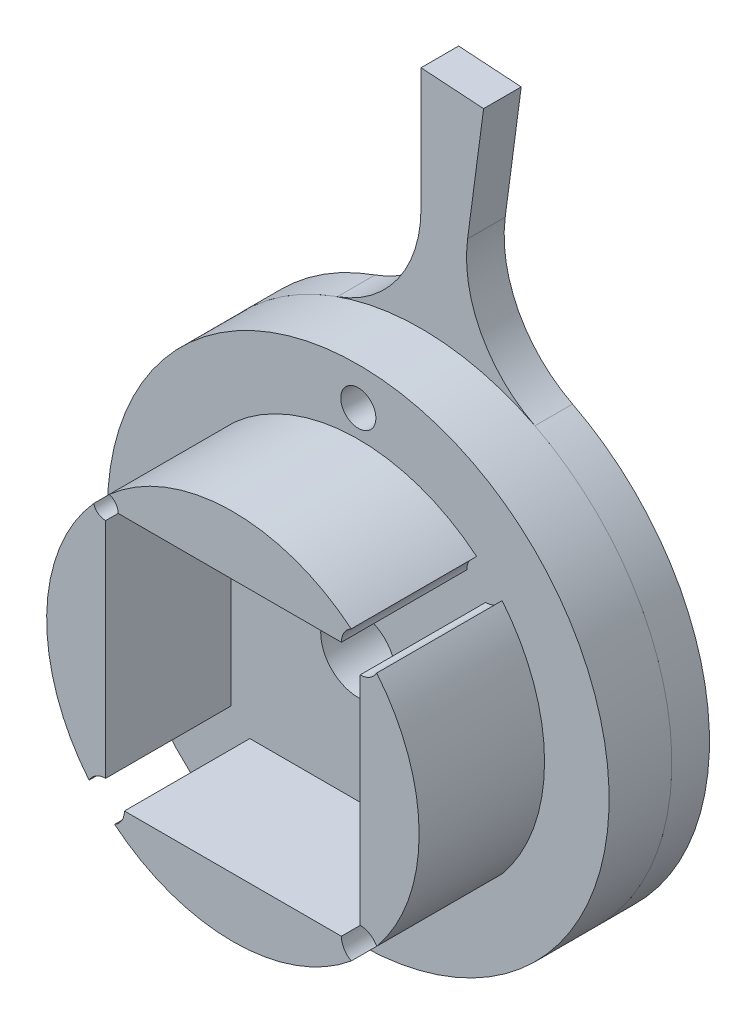
ISO-10303-21;
HEADER;
FILE_DESCRIPTION(('STEP AP214'),'2;1');
FILE_NAME('part.step','',(''),(''),'','','');
FILE_SCHEMA(('AUTOMOTIVE_DESIGN { 1 0 10303 214 1 1 1 1 }'));
ENDSEC;
DATA;
#1=APPLICATION_CONTEXT('core data for automotive mechanical design processes');
#2=APPLICATION_PROTOCOL_DEFINITION('international standard','automotive_design',2000,#1);
#3=PRODUCT_CONTEXT('',#1,'mechanical');
#4=PRODUCT('Part','Part','',(#3));
#5=PRODUCT_RELATED_PRODUCT_CATEGORY('part','',(#4));
#6=PRODUCT_DEFINITION_FORMATION('','',#4);
#7=PRODUCT_DEFINITION_CONTEXT('part definition',#1,'design');
#8=PRODUCT_DEFINITION('design','',#6,#7);
#9=PRODUCT_DEFINITION_SHAPE('','',#8);
#10=(LENGTH_UNIT() NAMED_UNIT(*) SI_UNIT(.MILLI.,.METRE.));
#11=(NAMED_UNIT(*) PLANE_ANGLE_UNIT() SI_UNIT($,.RADIAN.));
#12=(NAMED_UNIT(*) SI_UNIT($,.STERADIAN.) SOLID_ANGLE_UNIT());
#13=UNCERTAINTY_MEASURE_WITH_UNIT(LENGTH_MEASURE(1.E-05),#10,'distance_accuracy_value','');
#14=(GEOMETRIC_REPRESENTATION_CONTEXT(3) GLOBAL_UNCERTAINTY_ASSIGNED_CONTEXT((#13)) GLOBAL_UNIT_ASSIGNED_CONTEXT((#10,
#11,#12)) REPRESENTATION_CONTEXT('',''));
#15=CARTESIAN_POINT('',(0.,0.,0.));
#16=DIRECTION('',(0.,0.,1.));
#17=DIRECTION('',(1.,0.,0.));
#18=AXIS2_PLACEMENT_3D('',#15,#16,#17);
#19=CARTESIAN_POINT('',(0.,0.,-5.));
#20=DIRECTION('',(0.,0.,-1.));
#21=DIRECTION('',(-1.,0.,0.));
#22=AXIS2_PLACEMENT_3D('',#19,#20,#21);
#23=PLANE('',#22);
#24=CARTESIAN_POINT('',(0.,17.,-5.));
#25=DIRECTION('',(0.,0.,-1.));
#26=DIRECTION('',(-1.,0.,0.));
#27=AXIS2_PLACEMENT_3D('',#24,#25,#26);
#28=CIRCLE('',#27,1.4);
#29=CARTESIAN_POINT('',(-1.4,17.,-5.));
#30=VERTEX_POINT('',#29);
#31=EDGE_CURVE('E227',#30,#30,#28,.T.);
#32=ORIENTED_EDGE('',*,*,#31,.F.);
#33=EDGE_LOOP('',(#32));
#34=FACE_BOUND('',#33,.T.);
#35=CARTESIAN_POINT('',(0.,0.,-5.));
#36=DIRECTION('',(0.,0.,1.));
#37=DIRECTION('',(-1.,0.,0.));
#38=AXIS2_PLACEMENT_3D('',#35,#36,#37);
#39=CIRCLE('',#38,20.);
#40=CARTESIAN_POINT('',(-20.,0.,-5.));
#41=VERTEX_POINT('',#40);
#42=EDGE_CURVE('E13',#41,#41,#39,.T.);
#43=ORIENTED_EDGE('',*,*,#42,.F.);
#44=EDGE_LOOP('',(#43));
#45=FACE_BOUND('',#44,.T.);
#46=CARTESIAN_POINT('',(0.,0.,-5.));
#47=DIRECTION('',(0.,0.,-1.));
#48=DIRECTION('',(-1.,0.,0.));
#49=AXIS2_PLACEMENT_3D('',#46,#47,#48);
#50=CIRCLE('',#49,3.);
#51=CARTESIAN_POINT('',(-3.,0.,-5.));
#52=VERTEX_POINT('',#51);
#53=EDGE_CURVE('E223',#52,#52,#50,.T.);
#54=ORIENTED_EDGE('',*,*,#53,.F.);
#55=EDGE_LOOP('',(#54));
#56=FACE_BOUND('',#55,.T.);
#57=ADVANCED_FACE('F61',(#34,#45,#56),#23,.T.);
#58=CARTESIAN_POINT('',(0.,0.,-5.));
#59=DIRECTION('',(0.,0.,1.));
#60=DIRECTION('',(1.,0.,0.));
#61=AXIS2_PLACEMENT_3D('',#58,#59,#60);
#62=CYLINDRICAL_SURFACE('',#61,20.);
#63=CARTESIAN_POINT('',(0.,0.,0.));
#64=DIRECTION('',(0.,0.,-1.));
#65=DIRECTION('',(-1.,0.,0.));
#66=AXIS2_PLACEMENT_3D('',#63,#64,#65);
#67=CIRCLE('',#66,20.);
#68=CARTESIAN_POINT('',(-20.,0.,0.));
#69=VERTEX_POINT('',#68);
#70=EDGE_CURVE('E271',#69,#69,#67,.T.);
#71=ORIENTED_EDGE('',*,*,#70,.T.);
#72=EDGE_LOOP('',(#71));
#73=FACE_BOUND('',#72,.T.);
#74=ORIENTED_EDGE('',*,*,#42,.T.);
#75=EDGE_LOOP('',(#74));
#76=FACE_BOUND('',#75,.T.);
#77=ADVANCED_FACE('F461',(#73,#76),#62,.T.);
#78=CARTESIAN_POINT('',(0.,0.,-5.));
#79=DIRECTION('',(0.,0.,1.));
#80=DIRECTION('',(1.,0.,0.));
#81=AXIS2_PLACEMENT_3D('',#78,#79,#80);
#82=CYLINDRICAL_SURFACE('',#81,3.);
#83=CARTESIAN_POINT('',(0.,0.,0.));
#84=DIRECTION('',(0.,0.,-1.));
#85=DIRECTION('',(-1.,0.,0.));
#86=AXIS2_PLACEMENT_3D('',#83,#84,#85);
#87=CIRCLE('',#86,3.);
#88=CARTESIAN_POINT('',(-3.,0.,0.));
#89=VERTEX_POINT('',#88);
#90=EDGE_CURVE('E287',#89,#89,#87,.T.);
#91=ORIENTED_EDGE('',*,*,#90,.F.);
#92=EDGE_LOOP('',(#91));
#93=FACE_BOUND('',#92,.T.);
#94=ORIENTED_EDGE('',*,*,#53,.T.);
#95=EDGE_LOOP('',(#94));
#96=FACE_BOUND('',#95,.T.);
#97=ADVANCED_FACE('F63',(#93,#96),#82,.F.);
#98=CARTESIAN_POINT('',(-10.15,10.15,10.));
#99=DIRECTION('',(0.,0.,-1.));
#100=DIRECTION('',(-1.,0.,0.));
#101=AXIS2_PLACEMENT_3D('',#98,#99,#100);
#102=CYLINDRICAL_SURFACE('',#101,1.);
#103=CARTESIAN_POINT('',(-10.15,10.15,0.));
#104=DIRECTION('',(0.,0.,1.));
#105=DIRECTION('',(1.,0.,0.));
#106=AXIS2_PLACEMENT_3D('',#103,#104,#105);
#107=CIRCLE('',#106,1.);
#108=CARTESIAN_POINT('',(-9.15,10.15,0.));
#109=VERTEX_POINT('',#108);
#110=CARTESIAN_POINT('',(-9.85761543275644,11.1063008234012,0.));
#111=VERTEX_POINT('',#110);
#112=EDGE_CURVE('E268',#109,#111,#107,.T.);
#113=ORIENTED_EDGE('',*,*,#112,.F.);
#114=DIRECTION('',(0.,0.,-1.));
#115=VECTOR('',#114,1.);
#116=CARTESIAN_POINT('',(-9.15,10.15,10.));
#117=LINE('',#116,#115);
#118=CARTESIAN_POINT('',(-9.15,10.15,10.));
#119=VERTEX_POINT('',#118);
#120=EDGE_CURVE('E226',#119,#109,#117,.T.);
#121=ORIENTED_EDGE('',*,*,#120,.F.);
#122=CARTESIAN_POINT('',(-10.15,10.15,10.));
#123=DIRECTION('',(0.,0.,1.));
#124=DIRECTION('',(1.,0.,0.));
#125=AXIS2_PLACEMENT_3D('',#122,#123,#124);
#126=CIRCLE('',#125,1.);
#127=CARTESIAN_POINT('',(-9.85761543275644,11.1063008234012,10.));
#128=VERTEX_POINT('',#127);
#129=EDGE_CURVE('E261',#119,#128,#126,.T.);
#130=ORIENTED_EDGE('',*,*,#129,.T.);
#131=DIRECTION('',(0.,0.,-1.));
#132=VECTOR('',#131,1.);
#133=CARTESIAN_POINT('',(-9.85761543275644,11.1063008234012,10.));
#134=LINE('',#133,#132);
#135=EDGE_CURVE('E251',#128,#111,#134,.T.);
#136=ORIENTED_EDGE('',*,*,#135,.T.);
#137=EDGE_LOOP('',(#113,#121,#130,#136));
#138=FACE_BOUND('',#137,.T.);
#139=ADVANCED_FACE('F468',(#138),#102,.F.);
#140=CARTESIAN_POINT('',(0.,10.15,10.));
#141=DIRECTION('',(0.,1.,0.));
#142=DIRECTION('',(0.,0.,1.));
#143=AXIS2_PLACEMENT_3D('',#140,#141,#142);
#144=PLANE('',#143);
#145=DIRECTION('',(1.,0.,0.));
#146=VECTOR('',#145,1.);
#147=CARTESIAN_POINT('',(0.,10.15,0.));
#148=LINE('',#147,#146);
#149=CARTESIAN_POINT('',(8.65,10.15,0.));
#150=VERTEX_POINT('',#149);
#151=EDGE_CURVE('E264',#109,#150,#148,.T.);
#152=ORIENTED_EDGE('',*,*,#151,.T.);
#153=DIRECTION('',(0.,0.,-1.));
#154=VECTOR('',#153,1.);
#155=CARTESIAN_POINT('',(8.65,10.15,10.));
#156=LINE('',#155,#154);
#157=CARTESIAN_POINT('',(8.65,10.15,10.));
#158=VERTEX_POINT('',#157);
#159=EDGE_CURVE('E234',#158,#150,#156,.T.);
#160=ORIENTED_EDGE('',*,*,#159,.F.);
#161=DIRECTION('',(1.,0.,0.));
#162=VECTOR('',#161,1.);
#163=CARTESIAN_POINT('',(0.,10.15,10.));
#164=LINE('',#163,#162);
#165=EDGE_CURVE('E278',#119,#158,#164,.T.);
#166=ORIENTED_EDGE('',*,*,#165,.F.);
#167=ORIENTED_EDGE('',*,*,#120,.T.);
#168=EDGE_LOOP('',(#152,#160,#166,#167));
#169=FACE_BOUND('',#168,.T.);
#170=ADVANCED_FACE('F674',(#169),#144,.F.);
#171=CARTESIAN_POINT('',(10.15,10.15,10.));
#172=DIRECTION('',(0.,0.,-1.));
#173=DIRECTION('',(-1.,0.,0.));
#174=AXIS2_PLACEMENT_3D('',#171,#172,#173);
#175=CYLINDRICAL_SURFACE('',#174,1.5);
#176=CARTESIAN_POINT('',(10.15,10.15,0.));
#177=DIRECTION('',(0.,0.,1.));
#178=DIRECTION('',(1.,0.,0.));
#179=AXIS2_PLACEMENT_3D('',#176,#177,#178);
#180=CIRCLE('',#179,1.5);
#181=CARTESIAN_POINT('',(9.43416618438802,11.4681737170898,0.));
#182=VERTEX_POINT('',#181);
#183=EDGE_CURVE('E260',#182,#150,#180,.T.);
#184=ORIENTED_EDGE('',*,*,#183,.F.);
#185=DIRECTION('',(0.,0.,-1.));
#186=VECTOR('',#185,1.);
#187=CARTESIAN_POINT('',(9.43416618438802,11.4681737170898,10.));
#188=LINE('',#187,#186);
#189=CARTESIAN_POINT('',(9.43416618438802,11.4681737170898,10.));
#190=VERTEX_POINT('',#189);
#191=EDGE_CURVE('E247',#190,#182,#188,.T.);
#192=ORIENTED_EDGE('',*,*,#191,.F.);
#193=CARTESIAN_POINT('',(10.15,10.15,10.));
#194=DIRECTION('',(0.,0.,1.));
#195=DIRECTION('',(1.,0.,0.));
#196=AXIS2_PLACEMENT_3D('',#193,#194,#195);
#197=CIRCLE('',#196,1.5);
#198=EDGE_CURVE('E274',#190,#158,#197,.T.);
#199=ORIENTED_EDGE('',*,*,#198,.T.);
#200=ORIENTED_EDGE('',*,*,#159,.T.);
#201=EDGE_LOOP('',(#184,#192,#199,#200));
#202=FACE_BOUND('',#201,.T.);
#203=ADVANCED_FACE('F664',(#202),#175,.F.);
#204=CARTESIAN_POINT('',(0.,0.,10.));
#205=DIRECTION('',(0.,0.,-1.));
#206=DIRECTION('',(-1.,0.,0.));
#207=AXIS2_PLACEMENT_3D('',#204,#205,#206);
#208=CYLINDRICAL_SURFACE('',#207,14.85);
#209=CARTESIAN_POINT('',(0.,0.,0.));
#210=DIRECTION('',(0.,0.,1.));
#211=DIRECTION('',(1.,0.,0.));
#212=AXIS2_PLACEMENT_3D('',#209,#210,#211);
#213=CIRCLE('',#212,14.85);
#214=EDGE_CURVE('E256',#182,#111,#213,.T.);
#215=ORIENTED_EDGE('',*,*,#214,.T.);
#216=ORIENTED_EDGE('',*,*,#135,.F.);
#217=CARTESIAN_POINT('',(0.,0.,10.));
#218=DIRECTION('',(0.,0.,1.));
#219=DIRECTION('',(1.,0.,0.));
#220=AXIS2_PLACEMENT_3D('',#217,#218,#219);
#221=CIRCLE('',#220,14.85);
#222=EDGE_CURVE('E255',#190,#128,#221,.T.);
#223=ORIENTED_EDGE('',*,*,#222,.F.);
#224=ORIENTED_EDGE('',*,*,#191,.T.);
#225=EDGE_LOOP('',(#215,#216,#223,#224));
#226=FACE_BOUND('',#225,.T.);
#227=ADVANCED_FACE('F654',(#226),#208,.T.);
#228=CARTESIAN_POINT('',(0.,0.,10.));
#229=DIRECTION('',(0.,0.,1.));
#230=DIRECTION('',(1.,0.,0.));
#231=AXIS2_PLACEMENT_3D('',#228,#229,#230);
#232=PLANE('',#231);
#233=ORIENTED_EDGE('',*,*,#129,.F.);
#234=ORIENTED_EDGE('',*,*,#165,.T.);
#235=ORIENTED_EDGE('',*,*,#198,.F.);
#236=ORIENTED_EDGE('',*,*,#222,.T.);
#237=EDGE_LOOP('',(#233,#234,#235,#236));
#238=FACE_BOUND('',#237,.T.);
#239=ADVANCED_FACE('F527',(#238),#232,.T.);
#240=CARTESIAN_POINT('',(0.,0.,0.));
#241=DIRECTION('',(0.,0.,-1.));
#242=DIRECTION('',(-1.,0.,0.));
#243=AXIS2_PLACEMENT_3D('',#240,#241,#242);
#244=PLANE('',#243);
#245=CARTESIAN_POINT('',(0.,17.,0.));
#246=DIRECTION('',(0.,0.,-1.));
#247=DIRECTION('',(-1.,0.,0.));
#248=AXIS2_PLACEMENT_3D('',#245,#246,#247);
#249=CIRCLE('',#248,1.4);
#250=CARTESIAN_POINT('',(-1.4,17.,0.));
#251=VERTEX_POINT('',#250);
#252=EDGE_CURVE('E65',#251,#251,#249,.T.);
#253=ORIENTED_EDGE('',*,*,#252,.T.);
#254=EDGE_LOOP('',(#253));
#255=FACE_BOUND('',#254,.T.);
#256=CARTESIAN_POINT('',(0.,0.,0.));
#257=DIRECTION('',(0.,0.,1.));
#258=DIRECTION('',(1.,0.,0.));
#259=AXIS2_PLACEMENT_3D('',#256,#257,#258);
#260=CIRCLE('',#259,14.85);
#261=CARTESIAN_POINT('',(-9.43416618438802,-11.4681737170898,0.));
#262=VERTEX_POINT('',#261);
#263=CARTESIAN_POINT('',(9.43416618438802,-11.4681737170898,0.));
#264=VERTEX_POINT('',#263);
#265=EDGE_CURVE('E192',#262,#264,#260,.T.);
#266=ORIENTED_EDGE('',*,*,#265,.F.);
#267=CARTESIAN_POINT('',(-10.15,-10.15,0.));
#268=DIRECTION('',(0.,0.,1.));
#269=DIRECTION('',(1.,0.,0.));
#270=AXIS2_PLACEMENT_3D('',#267,#268,#269);
#271=CIRCLE('',#270,1.5);
#272=CARTESIAN_POINT('',(-8.65,-10.15,0.));
#273=VERTEX_POINT('',#272);
#274=EDGE_CURVE('E72',#262,#273,#271,.T.);
#275=ORIENTED_EDGE('',*,*,#274,.T.);
#276=DIRECTION('',(1.,0.,0.));
#277=VECTOR('',#276,1.);
#278=CARTESIAN_POINT('',(0.,-10.15,0.));
#279=LINE('',#278,#277);
#280=CARTESIAN_POINT('',(8.65000000000001,-10.15,0.));
#281=VERTEX_POINT('',#280);
#282=EDGE_CURVE('E193',#273,#281,#279,.T.);
#283=ORIENTED_EDGE('',*,*,#282,.T.);
#284=CARTESIAN_POINT('',(10.15,-10.15,0.));
#285=DIRECTION('',(0.,0.,1.));
#286=DIRECTION('',(1.,0.,0.));
#287=AXIS2_PLACEMENT_3D('',#284,#285,#286);
#288=CIRCLE('',#287,1.5);
#289=EDGE_CURVE('E182',#281,#264,#288,.T.);
#290=ORIENTED_EDGE('',*,*,#289,.T.);
#291=EDGE_LOOP('',(#266,#275,#283,#290));
#292=FACE_BOUND('',#291,.T.);
#293=CARTESIAN_POINT('',(0.,0.,0.));
#294=DIRECTION('',(0.,0.,1.));
#295=DIRECTION('',(1.,0.,0.));
#296=AXIS2_PLACEMENT_3D('',#293,#294,#295);
#297=CIRCLE('',#296,14.85);
#298=CARTESIAN_POINT('',(11.4681737170898,-9.43416618438801,0.));
#299=VERTEX_POINT('',#298);
#300=CARTESIAN_POINT('',(11.4681737170898,9.43416618438802,0.));
#301=VERTEX_POINT('',#300);
#302=EDGE_CURVE('E360',#299,#301,#297,.T.);
#303=ORIENTED_EDGE('',*,*,#302,.F.);
#304=CARTESIAN_POINT('',(10.15,-10.15,0.));
#305=DIRECTION('',(0.,0.,1.));
#306=DIRECTION('',(1.,0.,0.));
#307=AXIS2_PLACEMENT_3D('',#304,#305,#306);
#308=CIRCLE('',#307,1.5);
#309=CARTESIAN_POINT('',(10.15,-8.65,0.));
#310=VERTEX_POINT('',#309);
#311=EDGE_CURVE('E364',#299,#310,#308,.T.);
#312=ORIENTED_EDGE('',*,*,#311,.T.);
#313=DIRECTION('',(0.,-1.,0.));
#314=VECTOR('',#313,1.);
#315=CARTESIAN_POINT('',(10.15,0.,0.));
#316=LINE('',#315,#314);
#317=CARTESIAN_POINT('',(10.15,8.65,0.));
#318=VERTEX_POINT('',#317);
#319=EDGE_CURVE('E352',#318,#310,#316,.T.);
#320=ORIENTED_EDGE('',*,*,#319,.F.);
#321=CARTESIAN_POINT('',(10.15,10.15,0.));
#322=DIRECTION('',(0.,0.,1.));
#323=DIRECTION('',(1.,0.,0.));
#324=AXIS2_PLACEMENT_3D('',#321,#322,#323);
#325=CIRCLE('',#324,1.5);
#326=EDGE_CURVE('E356',#318,#301,#325,.T.);
#327=ORIENTED_EDGE('',*,*,#326,.T.);
#328=EDGE_LOOP('',(#303,#312,#320,#327));
#329=FACE_BOUND('',#328,.T.);
#330=CARTESIAN_POINT('',(0.,0.,0.));
#331=DIRECTION('',(0.,0.,1.));
#332=DIRECTION('',(1.,0.,0.));
#333=AXIS2_PLACEMENT_3D('',#330,#331,#332);
#334=CIRCLE('',#333,14.85);
#335=CARTESIAN_POINT('',(-11.1063008234012,9.85761543275644,0.));
#336=VERTEX_POINT('',#335);
#337=CARTESIAN_POINT('',(-11.4681737170898,-9.43416618438802,0.));
#338=VERTEX_POINT('',#337);
#339=EDGE_CURVE('E314',#336,#338,#334,.T.);
#340=ORIENTED_EDGE('',*,*,#339,.F.);
#341=CARTESIAN_POINT('',(-10.15,10.15,0.));
#342=DIRECTION('',(0.,0.,1.));
#343=DIRECTION('',(1.,0.,0.));
#344=AXIS2_PLACEMENT_3D('',#341,#342,#343);
#345=CIRCLE('',#344,1.);
#346=CARTESIAN_POINT('',(-10.15,9.15,0.));
#347=VERTEX_POINT('',#346);
#348=EDGE_CURVE('E318',#336,#347,#345,.T.);
#349=ORIENTED_EDGE('',*,*,#348,.T.);
#350=DIRECTION('',(0.,-1.,0.));
#351=VECTOR('',#350,1.);
#352=CARTESIAN_POINT('',(-10.15,0.,0.));
#353=LINE('',#352,#351);
#354=CARTESIAN_POINT('',(-10.15,-8.65,0.));
#355=VERTEX_POINT('',#354);
#356=EDGE_CURVE('E305',#347,#355,#353,.T.);
#357=ORIENTED_EDGE('',*,*,#356,.T.);
#358=CARTESIAN_POINT('',(-10.15,-10.15,0.));
#359=DIRECTION('',(0.,0.,1.));
#360=DIRECTION('',(1.,0.,0.));
#361=AXIS2_PLACEMENT_3D('',#358,#359,#360);
#362=CIRCLE('',#361,1.5);
#363=EDGE_CURVE('E309',#355,#338,#362,.T.);
#364=ORIENTED_EDGE('',*,*,#363,.T.);
#365=EDGE_LOOP('',(#340,#349,#357,#364));
#366=FACE_BOUND('',#365,.T.);
#367=ORIENTED_EDGE('',*,*,#70,.F.);
#368=EDGE_LOOP('',(#367));
#369=FACE_BOUND('',#368,.T.);
#370=ORIENTED_EDGE('',*,*,#90,.T.);
#371=EDGE_LOOP('',(#370));
#372=FACE_BOUND('',#371,.T.);
#373=ORIENTED_EDGE('',*,*,#151,.F.);
#374=ORIENTED_EDGE('',*,*,#112,.T.);
#375=ORIENTED_EDGE('',*,*,#214,.F.);
#376=ORIENTED_EDGE('',*,*,#183,.T.);
#377=EDGE_LOOP('',(#373,#374,#375,#376));
#378=FACE_BOUND('',#377,.T.);
#379=ADVANCED_FACE('F203',(#255,#292,#329,#366,#369,#372,#378),#244,.F.);
#380=CARTESIAN_POINT('',(-10.15,10.15,10.));
#381=DIRECTION('',(0.,0.,-1.));
#382=DIRECTION('',(-1.,0.,0.));
#383=AXIS2_PLACEMENT_3D('',#380,#381,#382);
#384=CYLINDRICAL_SURFACE('',#383,1.);
#385=ORIENTED_EDGE('',*,*,#348,.F.);
#386=DIRECTION('',(0.,0.,-1.));
#387=VECTOR('',#386,1.);
#388=CARTESIAN_POINT('',(-11.1063008234012,9.85761543275644,10.));
#389=LINE('',#388,#387);
#390=CARTESIAN_POINT('',(-11.1063008234012,9.85761543275644,10.));
#391=VERTEX_POINT('',#390);
#392=EDGE_CURVE('E291',#391,#336,#389,.T.);
#393=ORIENTED_EDGE('',*,*,#392,.F.);
#394=CARTESIAN_POINT('',(-10.15,10.15,10.));
#395=DIRECTION('',(0.,0.,1.));
#396=DIRECTION('',(1.,0.,0.));
#397=AXIS2_PLACEMENT_3D('',#394,#395,#396);
#398=CIRCLE('',#397,1.);
#399=CARTESIAN_POINT('',(-10.15,9.15,10.));
#400=VERTEX_POINT('',#399);
#401=EDGE_CURVE('E310',#391,#400,#398,.T.);
#402=ORIENTED_EDGE('',*,*,#401,.T.);
#403=DIRECTION('',(0.,0.,-1.));
#404=VECTOR('',#403,1.);
#405=CARTESIAN_POINT('',(-10.15,9.15,10.));
#406=LINE('',#405,#404);
#407=EDGE_CURVE('E301',#400,#347,#406,.T.);
#408=ORIENTED_EDGE('',*,*,#407,.T.);
#409=EDGE_LOOP('',(#385,#393,#402,#408));
#410=FACE_BOUND('',#409,.T.);
#411=ADVANCED_FACE('F526',(#410),#384,.F.);
#412=CARTESIAN_POINT('',(0.,0.,10.));
#413=DIRECTION('',(0.,0.,-1.));
#414=DIRECTION('',(-1.,0.,0.));
#415=AXIS2_PLACEMENT_3D('',#412,#413,#414);
#416=CYLINDRICAL_SURFACE('',#415,14.85);
#417=ORIENTED_EDGE('',*,*,#339,.T.);
#418=DIRECTION('',(0.,0.,-1.));
#419=VECTOR('',#418,1.);
#420=CARTESIAN_POINT('',(-11.4681737170898,-9.43416618438802,10.));
#421=LINE('',#420,#419);
#422=CARTESIAN_POINT('',(-11.4681737170898,-9.43416618438802,10.));
#423=VERTEX_POINT('',#422);
#424=EDGE_CURVE('E294',#423,#338,#421,.T.);
#425=ORIENTED_EDGE('',*,*,#424,.F.);
#426=CARTESIAN_POINT('',(0.,0.,10.));
#427=DIRECTION('',(0.,0.,1.));
#428=DIRECTION('',(1.,0.,0.));
#429=AXIS2_PLACEMENT_3D('',#426,#427,#428);
#430=CIRCLE('',#429,14.85);
#431=EDGE_CURVE('E330',#391,#423,#430,.T.);
#432=ORIENTED_EDGE('',*,*,#431,.F.);
#433=ORIENTED_EDGE('',*,*,#392,.T.);
#434=EDGE_LOOP('',(#417,#425,#432,#433));
#435=FACE_BOUND('',#434,.T.);
#436=ADVANCED_FACE('F627',(#435),#416,.T.);
#437=CARTESIAN_POINT('',(-10.15,-10.15,10.));
#438=DIRECTION('',(0.,0.,-1.));
#439=DIRECTION('',(-1.,0.,0.));
#440=AXIS2_PLACEMENT_3D('',#437,#438,#439);
#441=CYLINDRICAL_SURFACE('',#440,1.5);
#442=ORIENTED_EDGE('',*,*,#363,.F.);
#443=DIRECTION('',(0.,0.,-1.));
#444=VECTOR('',#443,1.);
#445=CARTESIAN_POINT('',(-10.15,-8.65,10.));
#446=LINE('',#445,#444);
#447=CARTESIAN_POINT('',(-10.15,-8.65,10.));
#448=VERTEX_POINT('',#447);
#449=EDGE_CURVE('E297',#448,#355,#446,.T.);
#450=ORIENTED_EDGE('',*,*,#449,.F.);
#451=CARTESIAN_POINT('',(-10.15,-10.15,10.));
#452=DIRECTION('',(0.,0.,1.));
#453=DIRECTION('',(1.,0.,0.));
#454=AXIS2_PLACEMENT_3D('',#451,#452,#453);
#455=CIRCLE('',#454,1.5);
#456=EDGE_CURVE('E326',#448,#423,#455,.T.);
#457=ORIENTED_EDGE('',*,*,#456,.T.);
#458=ORIENTED_EDGE('',*,*,#424,.T.);
#459=EDGE_LOOP('',(#442,#450,#457,#458));
#460=FACE_BOUND('',#459,.T.);
#461=ADVANCED_FACE('F616',(#460),#441,.F.);
#462=CARTESIAN_POINT('',(-10.15,0.,10.));
#463=DIRECTION('',(1.,0.,0.));
#464=DIRECTION('',(0.,1.,0.));
#465=AXIS2_PLACEMENT_3D('',#462,#463,#464);
#466=PLANE('',#465);
#467=ORIENTED_EDGE('',*,*,#356,.F.);
#468=ORIENTED_EDGE('',*,*,#407,.F.);
#469=DIRECTION('',(0.,-1.,0.));
#470=VECTOR('',#469,1.);
#471=CARTESIAN_POINT('',(-10.15,0.,10.));
#472=LINE('',#471,#470);
#473=EDGE_CURVE('E304',#400,#448,#472,.T.);
#474=ORIENTED_EDGE('',*,*,#473,.T.);
#475=ORIENTED_EDGE('',*,*,#449,.T.);
#476=EDGE_LOOP('',(#467,#468,#474,#475));
#477=FACE_BOUND('',#476,.T.);
#478=ADVANCED_FACE('F605',(#477),#466,.T.);
#479=CARTESIAN_POINT('',(0.,0.,10.));
#480=DIRECTION('',(0.,0.,1.));
#481=DIRECTION('',(1.,0.,0.));
#482=AXIS2_PLACEMENT_3D('',#479,#480,#481);
#483=PLANE('',#482);
#484=ORIENTED_EDGE('',*,*,#401,.F.);
#485=ORIENTED_EDGE('',*,*,#431,.T.);
#486=ORIENTED_EDGE('',*,*,#456,.F.);
#487=ORIENTED_EDGE('',*,*,#473,.F.);
#488=EDGE_LOOP('',(#484,#485,#486,#487));
#489=FACE_BOUND('',#488,.T.);
#490=ADVANCED_FACE('F595',(#489),#483,.T.);
#491=CARTESIAN_POINT('',(10.15,-10.15,10.));
#492=DIRECTION('',(0.,0.,-1.));
#493=DIRECTION('',(-1.,0.,0.));
#494=AXIS2_PLACEMENT_3D('',#491,#492,#493);
#495=CYLINDRICAL_SURFACE('',#494,1.5);
#496=ORIENTED_EDGE('',*,*,#311,.F.);
#497=DIRECTION('',(0.,0.,-1.));
#498=VECTOR('',#497,1.);
#499=CARTESIAN_POINT('',(11.4681737170898,-9.43416618438802,10.));
#500=LINE('',#499,#498);
#501=CARTESIAN_POINT('',(11.4681737170898,-9.43416618438802,10.));
#502=VERTEX_POINT('',#501);
#503=EDGE_CURVE('E322',#502,#299,#500,.T.);
#504=ORIENTED_EDGE('',*,*,#503,.F.);
#505=CARTESIAN_POINT('',(10.15,-10.15,10.));
#506=DIRECTION('',(0.,0.,1.));
#507=DIRECTION('',(1.,0.,0.));
#508=AXIS2_PLACEMENT_3D('',#505,#506,#507);
#509=CIRCLE('',#508,1.5);
#510=CARTESIAN_POINT('',(10.15,-8.65,10.));
#511=VERTEX_POINT('',#510);
#512=EDGE_CURVE('E357',#502,#511,#509,.T.);
#513=ORIENTED_EDGE('',*,*,#512,.T.);
#514=DIRECTION('',(0.,0.,-1.));
#515=VECTOR('',#514,1.);
#516=CARTESIAN_POINT('',(10.15,-8.65,10.));
#517=LINE('',#516,#515);
#518=EDGE_CURVE('E347',#511,#310,#517,.T.);
#519=ORIENTED_EDGE('',*,*,#518,.T.);
#520=EDGE_LOOP('',(#496,#504,#513,#519));
#521=FACE_BOUND('',#520,.T.);
#522=ADVANCED_FACE('F437',(#521),#495,.F.);
#523=CARTESIAN_POINT('',(0.,0.,10.));
#524=DIRECTION('',(0.,0.,-1.));
#525=DIRECTION('',(-1.,0.,0.));
#526=AXIS2_PLACEMENT_3D('',#523,#524,#525);
#527=CYLINDRICAL_SURFACE('',#526,14.85);
#528=ORIENTED_EDGE('',*,*,#302,.T.);
#529=DIRECTION('',(0.,0.,-1.));
#530=VECTOR('',#529,1.);
#531=CARTESIAN_POINT('',(11.4681737170898,9.43416618438802,10.));
#532=LINE('',#531,#530);
#533=CARTESIAN_POINT('',(11.4681737170898,9.43416618438802,10.));
#534=VERTEX_POINT('',#533);
#535=EDGE_CURVE('E339',#534,#301,#532,.T.);
#536=ORIENTED_EDGE('',*,*,#535,.F.);
#537=CARTESIAN_POINT('',(0.,0.,10.));
#538=DIRECTION('',(0.,0.,1.));
#539=DIRECTION('',(1.,0.,0.));
#540=AXIS2_PLACEMENT_3D('',#537,#538,#539);
#541=CIRCLE('',#540,14.85);
#542=EDGE_CURVE('E373',#502,#534,#541,.T.);
#543=ORIENTED_EDGE('',*,*,#542,.F.);
#544=ORIENTED_EDGE('',*,*,#503,.T.);
#545=EDGE_LOOP('',(#528,#536,#543,#544));
#546=FACE_BOUND('',#545,.T.);
#547=ADVANCED_FACE('F450',(#546),#527,.T.);
#548=CARTESIAN_POINT('',(10.15,10.15,10.));
#549=DIRECTION('',(0.,0.,-1.));
#550=DIRECTION('',(-1.,0.,0.));
#551=AXIS2_PLACEMENT_3D('',#548,#549,#550);
#552=CYLINDRICAL_SURFACE('',#551,1.5);
#553=ORIENTED_EDGE('',*,*,#326,.F.);
#554=DIRECTION('',(0.,0.,-1.));
#555=VECTOR('',#554,1.);
#556=CARTESIAN_POINT('',(10.15,8.65,10.));
#557=LINE('',#556,#555);
#558=CARTESIAN_POINT('',(10.15,8.65,10.));
#559=VERTEX_POINT('',#558);
#560=EDGE_CURVE('E343',#559,#318,#557,.T.);
#561=ORIENTED_EDGE('',*,*,#560,.F.);
#562=CARTESIAN_POINT('',(10.15,10.15,10.));
#563=DIRECTION('',(0.,0.,1.));
#564=DIRECTION('',(1.,0.,0.));
#565=AXIS2_PLACEMENT_3D('',#562,#563,#564);
#566=CIRCLE('',#565,1.5);
#567=EDGE_CURVE('E369',#559,#534,#566,.T.);
#568=ORIENTED_EDGE('',*,*,#567,.T.);
#569=ORIENTED_EDGE('',*,*,#535,.T.);
#570=EDGE_LOOP('',(#553,#561,#568,#569));
#571=FACE_BOUND('',#570,.T.);
#572=ADVANCED_FACE('F452',(#571),#552,.F.);
#573=CARTESIAN_POINT('',(10.15,0.,10.));
#574=DIRECTION('',(1.,0.,0.));
#575=DIRECTION('',(0.,1.,0.));
#576=AXIS2_PLACEMENT_3D('',#573,#574,#575);
#577=PLANE('',#576);
#578=ORIENTED_EDGE('',*,*,#319,.T.);
#579=ORIENTED_EDGE('',*,*,#518,.F.);
#580=DIRECTION('',(0.,-1.,0.));
#581=VECTOR('',#580,1.);
#582=CARTESIAN_POINT('',(10.15,0.,10.));
#583=LINE('',#582,#581);
#584=EDGE_CURVE('E351',#559,#511,#583,.T.);
#585=ORIENTED_EDGE('',*,*,#584,.F.);
#586=ORIENTED_EDGE('',*,*,#560,.T.);
#587=EDGE_LOOP('',(#578,#579,#585,#586));
#588=FACE_BOUND('',#587,.T.);
#589=ADVANCED_FACE('F446',(#588),#577,.F.);
#590=CARTESIAN_POINT('',(0.,0.,10.));
#591=DIRECTION('',(0.,0.,1.));
#592=DIRECTION('',(1.,0.,0.));
#593=AXIS2_PLACEMENT_3D('',#590,#591,#592);
#594=PLANE('',#593);
#595=ORIENTED_EDGE('',*,*,#512,.F.);
#596=ORIENTED_EDGE('',*,*,#542,.T.);
#597=ORIENTED_EDGE('',*,*,#567,.F.);
#598=ORIENTED_EDGE('',*,*,#584,.T.);
#599=EDGE_LOOP('',(#595,#596,#597,#598));
#600=FACE_BOUND('',#599,.T.);
#601=ADVANCED_FACE('F441',(#600),#594,.T.);
#602=CARTESIAN_POINT('',(-10.15,-10.15,10.));
#603=DIRECTION('',(0.,0.,-1.));
#604=DIRECTION('',(-1.,0.,0.));
#605=AXIS2_PLACEMENT_3D('',#602,#603,#604);
#606=CYLINDRICAL_SURFACE('',#605,1.5);
#607=ORIENTED_EDGE('',*,*,#274,.F.);
#608=DIRECTION('',(0.,0.,-1.));
#609=VECTOR('',#608,1.);
#610=CARTESIAN_POINT('',(-9.43416618438802,-11.4681737170898,10.));
#611=LINE('',#610,#609);
#612=CARTESIAN_POINT('',(-9.43416618438802,-11.4681737170898,10.));
#613=VERTEX_POINT('',#612);
#614=EDGE_CURVE('E81',#613,#262,#611,.T.);
#615=ORIENTED_EDGE('',*,*,#614,.F.);
#616=CARTESIAN_POINT('',(-10.15,-10.15,10.));
#617=DIRECTION('',(0.,0.,1.));
#618=DIRECTION('',(1.,0.,0.));
#619=AXIS2_PLACEMENT_3D('',#616,#617,#618);
#620=CIRCLE('',#619,1.5);
#621=CARTESIAN_POINT('',(-8.65,-10.15,10.));
#622=VERTEX_POINT('',#621);
#623=EDGE_CURVE('E206',#613,#622,#620,.T.);
#624=ORIENTED_EDGE('',*,*,#623,.T.);
#625=DIRECTION('',(0.,0.,-1.));
#626=VECTOR('',#625,1.);
#627=CARTESIAN_POINT('',(-8.65,-10.15,10.));
#628=LINE('',#627,#626);
#629=EDGE_CURVE('E104',#622,#273,#628,.T.);
#630=ORIENTED_EDGE('',*,*,#629,.T.);
#631=EDGE_LOOP('',(#607,#615,#624,#630));
#632=FACE_BOUND('',#631,.T.);
#633=ADVANCED_FACE('F485',(#632),#606,.F.);
#634=CARTESIAN_POINT('',(0.,0.,10.));
#635=DIRECTION('',(0.,0.,-1.));
#636=DIRECTION('',(-1.,0.,0.));
#637=AXIS2_PLACEMENT_3D('',#634,#635,#636);
#638=CYLINDRICAL_SURFACE('',#637,14.85);
#639=ORIENTED_EDGE('',*,*,#265,.T.);
#640=DIRECTION('',(0.,0.,-1.));
#641=VECTOR('',#640,1.);
#642=CARTESIAN_POINT('',(9.43416618438802,-11.4681737170898,10.));
#643=LINE('',#642,#641);
#644=CARTESIAN_POINT('',(9.43416618438802,-11.4681737170898,10.));
#645=VERTEX_POINT('',#644);
#646=EDGE_CURVE('E187',#645,#264,#643,.T.);
#647=ORIENTED_EDGE('',*,*,#646,.F.);
#648=CARTESIAN_POINT('',(0.,0.,10.));
#649=DIRECTION('',(0.,0.,1.));
#650=DIRECTION('',(1.,0.,0.));
#651=AXIS2_PLACEMENT_3D('',#648,#649,#650);
#652=CIRCLE('',#651,14.85);
#653=EDGE_CURVE('E99',#613,#645,#652,.T.);
#654=ORIENTED_EDGE('',*,*,#653,.F.);
#655=ORIENTED_EDGE('',*,*,#614,.T.);
#656=EDGE_LOOP('',(#639,#647,#654,#655));
#657=FACE_BOUND('',#656,.T.);
#658=ADVANCED_FACE('F482',(#657),#638,.T.);
#659=CARTESIAN_POINT('',(10.15,-10.15,10.));
#660=DIRECTION('',(0.,0.,-1.));
#661=DIRECTION('',(-1.,0.,0.));
#662=AXIS2_PLACEMENT_3D('',#659,#660,#661);
#663=CYLINDRICAL_SURFACE('',#662,1.5);
#664=ORIENTED_EDGE('',*,*,#289,.F.);
#665=DIRECTION('',(0.,0.,-1.));
#666=VECTOR('',#665,1.);
#667=CARTESIAN_POINT('',(8.65000000000001,-10.15,10.));
#668=LINE('',#667,#666);
#669=CARTESIAN_POINT('',(8.65000000000001,-10.15,10.));
#670=VERTEX_POINT('',#669);
#671=EDGE_CURVE('E186',#670,#281,#668,.T.);
#672=ORIENTED_EDGE('',*,*,#671,.F.);
#673=CARTESIAN_POINT('',(10.15,-10.15,10.));
#674=DIRECTION('',(0.,0.,1.));
#675=DIRECTION('',(1.,0.,0.));
#676=AXIS2_PLACEMENT_3D('',#673,#674,#675);
#677=CIRCLE('',#676,1.5);
#678=EDGE_CURVE('E219',#670,#645,#677,.T.);
#679=ORIENTED_EDGE('',*,*,#678,.T.);
#680=ORIENTED_EDGE('',*,*,#646,.T.);
#681=EDGE_LOOP('',(#664,#672,#679,#680));
#682=FACE_BOUND('',#681,.T.);
#683=ADVANCED_FACE('F184',(#682),#663,.F.);
#684=CARTESIAN_POINT('',(0.,-10.15,10.));
#685=DIRECTION('',(0.,1.,0.));
#686=DIRECTION('',(0.,0.,1.));
#687=AXIS2_PLACEMENT_3D('',#684,#685,#686);
#688=PLANE('',#687);
#689=ORIENTED_EDGE('',*,*,#282,.F.);
#690=ORIENTED_EDGE('',*,*,#629,.F.);
#691=DIRECTION('',(1.,0.,0.));
#692=VECTOR('',#691,1.);
#693=CARTESIAN_POINT('',(0.,-10.15,10.));
#694=LINE('',#693,#692);
#695=EDGE_CURVE('E200',#622,#670,#694,.T.);
#696=ORIENTED_EDGE('',*,*,#695,.T.);
#697=ORIENTED_EDGE('',*,*,#671,.T.);
#698=EDGE_LOOP('',(#689,#690,#696,#697));
#699=FACE_BOUND('',#698,.T.);
#700=ADVANCED_FACE('F197',(#699),#688,.T.);
#701=CARTESIAN_POINT('',(0.,0.,10.));
#702=DIRECTION('',(0.,0.,1.));
#703=DIRECTION('',(1.,0.,0.));
#704=AXIS2_PLACEMENT_3D('',#701,#702,#703);
#705=PLANE('',#704);
#706=ORIENTED_EDGE('',*,*,#623,.F.);
#707=ORIENTED_EDGE('',*,*,#653,.T.);
#708=ORIENTED_EDGE('',*,*,#678,.F.);
#709=ORIENTED_EDGE('',*,*,#695,.F.);
#710=EDGE_LOOP('',(#706,#707,#708,#709));
#711=FACE_BOUND('',#710,.T.);
#712=ADVANCED_FACE('F473',(#711),#705,.T.);
#713=CARTESIAN_POINT('',(0.,17.,2.));
#714=DIRECTION('',(0.,0.,-1.));
#715=DIRECTION('',(-1.,0.,0.));
#716=AXIS2_PLACEMENT_3D('',#713,#714,#715);
#717=CYLINDRICAL_SURFACE('',#716,1.4);
#718=ORIENTED_EDGE('',*,*,#31,.T.);
#719=EDGE_LOOP('',(#718));
#720=FACE_BOUND('',#719,.T.);
#721=ORIENTED_EDGE('',*,*,#252,.F.);
#722=EDGE_LOOP('',(#721));
#723=FACE_BOUND('',#722,.T.);
#724=ADVANCED_FACE('F472',(#720,#723),#717,.F.);
#725=CLOSED_SHELL('',(#57,#77,#97,#139,#170,#203,#227,#239,#379,#411,#436,#461,#478,#490,#522,
#547,#572,#589,#601,#633,#658,#683,#700,#712,#724));
#726=MANIFOLD_SOLID_BREP('B2',#725);
#727=CARTESIAN_POINT('',(0.,38.,-5.));
#728=DIRECTION('',(0.0657894736842107,0.997833525770884,0.));
#729=DIRECTION('',(-0.997833525770885,0.0657894736842107,0.));
#730=AXIS2_PLACEMENT_3D('',#727,#728,#729);
#731=PLANE('',#730);
#732=DIRECTION('',(0.997833525770885,-0.0657894736842107,0.));
#733=VECTOR('',#732,1.);
#734=CARTESIAN_POINT('',(0.,38.,-8.));
#735=LINE('',#734,#733);
#736=CARTESIAN_POINT('',(0.,38.,-8.));
#737=VERTEX_POINT('',#736);
#738=CARTESIAN_POINT('',(4.98916762885442,37.6710526315789,-8.));
#739=VERTEX_POINT('',#738);
#740=EDGE_CURVE('E872',#737,#739,#735,.T.);
#741=ORIENTED_EDGE('',*,*,#740,.F.);
#742=DIRECTION('',(0.,0.,-1.));
#743=VECTOR('',#742,1.);
#744=CARTESIAN_POINT('',(0.,38.,-5.));
#745=LINE('',#744,#743);
#746=CARTESIAN_POINT('',(0.,38.,-5.));
#747=VERTEX_POINT('',#746);
#748=EDGE_CURVE('E853',#747,#737,#745,.T.);
#749=ORIENTED_EDGE('',*,*,#748,.F.);
#750=DIRECTION('',(0.997833525770885,-0.0657894736842107,0.));
#751=VECTOR('',#750,1.);
#752=CARTESIAN_POINT('',(0.,38.,-5.));
#753=LINE('',#752,#751);
#754=CARTESIAN_POINT('',(4.98916762885442,37.6710526315789,-5.));
#755=VERTEX_POINT('',#754);
#756=EDGE_CURVE('E860',#747,#755,#753,.T.);
#757=ORIENTED_EDGE('',*,*,#756,.T.);
#758=DIRECTION('',(0.,0.,-1.));
#759=VECTOR('',#758,1.);
#760=CARTESIAN_POINT('',(4.98916762885442,37.6710526315789,-5.));
#761=LINE('',#760,#759);
#762=EDGE_CURVE('E841',#755,#739,#761,.T.);
#763=ORIENTED_EDGE('',*,*,#762,.T.);
#764=EDGE_LOOP('',(#741,#749,#757,#763));
#765=FACE_BOUND('',#764,.T.);
#766=ADVANCED_FACE('F788',(#765),#731,.T.);
#767=CARTESIAN_POINT('',(2.62587769939707,19.8268698060942,-5.));
#768=DIRECTION('',(0.991343490304709,-0.131293884969853,0.));
#769=DIRECTION('',(0.131293884969853,0.991343490304709,0.));
#770=AXIS2_PLACEMENT_3D('',#767,#768,#769);
#771=PLANE('',#770);
#772=DIRECTION('',(-0.131293884969853,-0.991343490304709,0.));
#773=VECTOR('',#772,1.);
#774=CARTESIAN_POINT('',(2.62587769939707,19.8268698060942,-5.));
#775=LINE('',#774,#773);
#776=CARTESIAN_POINT('',(3.71355185562039,28.039428179184,-5.));
#777=VERTEX_POINT('',#776);
#778=EDGE_CURVE('E845',#755,#777,#775,.T.);
#779=ORIENTED_EDGE('',*,*,#778,.T.);
#780=DIRECTION('',(0.,0.,1.));
#781=VECTOR('',#780,1.);
#782=CARTESIAN_POINT('',(3.71355185562039,28.039428179184,-5.));
#783=LINE('',#782,#781);
#784=CARTESIAN_POINT('',(3.71355185562039,28.039428179184,-8.));
#785=VERTEX_POINT('',#784);
#786=EDGE_CURVE('E882',#777,#785,#783,.F.);
#787=ORIENTED_EDGE('',*,*,#786,.T.);
#788=DIRECTION('',(-0.131293884969853,-0.991343490304709,0.));
#789=VECTOR('',#788,1.);
#790=CARTESIAN_POINT('',(2.62587769939707,19.8268698060942,-8.));
#791=LINE('',#790,#789);
#792=EDGE_CURVE('E848',#739,#785,#791,.T.);
#793=ORIENTED_EDGE('',*,*,#792,.F.);
#794=ORIENTED_EDGE('',*,*,#762,.F.);
#795=EDGE_LOOP('',(#779,#787,#793,#794));
#796=FACE_BOUND('',#795,.T.);
#797=ADVANCED_FACE('F843',(#796),#771,.T.);
#798=CARTESIAN_POINT('',(0.,0.,-5.));
#799=DIRECTION('',(0.,0.,1.));
#800=DIRECTION('',(1.,0.,0.));
#801=AXIS2_PLACEMENT_3D('',#798,#799,#800);
#802=CYLINDRICAL_SURFACE('',#801,20.);
#803=DIRECTION('',(0.,0.,1.));
#804=VECTOR('',#803,1.);
#805=CARTESIAN_POINT('',(9.08465783911166,17.8176595529903,-5.));
#806=LINE('',#805,#804);
#807=CARTESIAN_POINT('',(9.08465783911165,17.8176595529903,-8.));
#808=VERTEX_POINT('',#807);
#809=CARTESIAN_POINT('',(9.08465783911165,17.8176595529903,-5.));
#810=VERTEX_POINT('',#809);
#811=EDGE_CURVE('E886',#808,#810,#806,.T.);
#812=ORIENTED_EDGE('',*,*,#811,.T.);
#813=CARTESIAN_POINT('',(0.,0.,-5.));
#814=DIRECTION('',(0.,0.,-1.));
#815=DIRECTION('',(-1.,0.,0.));
#816=AXIS2_PLACEMENT_3D('',#813,#814,#815);
#817=CIRCLE('',#816,20.);
#818=CARTESIAN_POINT('',(-6.66666666666667,18.8561808316413,-5.));
#819=VERTEX_POINT('',#818);
#820=EDGE_CURVE('E797',#810,#819,#817,.T.);
#821=ORIENTED_EDGE('',*,*,#820,.T.);
#822=DIRECTION('',(0.,0.,1.));
#823=VECTOR('',#822,1.);
#824=CARTESIAN_POINT('',(-6.66666666666667,18.8561808316413,-5.));
#825=LINE('',#824,#823);
#826=CARTESIAN_POINT('',(-6.66666666666667,18.8561808316413,-8.));
#827=VERTEX_POINT('',#826);
#828=EDGE_CURVE('E884',#819,#827,#825,.F.);
#829=ORIENTED_EDGE('',*,*,#828,.T.);
#830=CARTESIAN_POINT('',(0.,0.,-8.));
#831=DIRECTION('',(0.,0.,-1.));
#832=DIRECTION('',(-1.,0.,0.));
#833=AXIS2_PLACEMENT_3D('',#830,#831,#832);
#834=CIRCLE('',#833,20.);
#835=EDGE_CURVE('E879',#808,#827,#834,.T.);
#836=ORIENTED_EDGE('',*,*,#835,.F.);
#837=EDGE_LOOP('',(#812,#821,#829,#836));
#838=FACE_BOUND('',#837,.T.);
#839=ADVANCED_FACE('F901',(#838),#802,.T.);
#840=CARTESIAN_POINT('',(0.,0.,-8.));
#841=DIRECTION('',(0.,0.,-1.));
#842=DIRECTION('',(-1.,0.,0.));
#843=AXIS2_PLACEMENT_3D('',#840,#841,#842);
#844=PLANE('',#843);
#845=CARTESIAN_POINT('',(0.,17.,-8.));
#846=DIRECTION('',(0.,0.,-1.));
#847=DIRECTION('',(-1.,0.,0.));
#848=AXIS2_PLACEMENT_3D('',#845,#846,#847);
#849=CIRCLE('',#848,1.4);
#850=CARTESIAN_POINT('',(-1.4,17.,-8.));
#851=VERTEX_POINT('',#850);
#852=EDGE_CURVE('E869',#851,#851,#849,.T.);
#853=ORIENTED_EDGE('',*,*,#852,.F.);
#854=EDGE_LOOP('',(#853));
#855=FACE_BOUND('',#854,.T.);
#856=ORIENTED_EDGE('',*,*,#792,.T.);
#857=CARTESIAN_POINT('',(13.6269867586675,26.7264893294855,-8.));
#858=DIRECTION('',(0.,0.,-1.));
#859=DIRECTION('',(-1.,0.,0.));
#860=AXIS2_PLACEMENT_3D('',#857,#858,#859);
#861=CIRCLE('',#860,10.);
#862=EDGE_CURVE('E890',#785,#808,#861,.F.);
#863=ORIENTED_EDGE('',*,*,#862,.T.);
#864=ORIENTED_EDGE('',*,*,#835,.T.);
#865=CARTESIAN_POINT('',(-10.,28.2842712474619,-8.));
#866=DIRECTION('',(0.,0.,-1.));
#867=DIRECTION('',(-1.,0.,0.));
#868=AXIS2_PLACEMENT_3D('',#865,#866,#867);
#869=CIRCLE('',#868,10.);
#870=CARTESIAN_POINT('',(0.,28.2842712474619,-8.));
#871=VERTEX_POINT('',#870);
#872=EDGE_CURVE('E893',#827,#871,#869,.F.);
#873=ORIENTED_EDGE('',*,*,#872,.T.);
#874=DIRECTION('',(0.,1.,0.));
#875=VECTOR('',#874,1.);
#876=CARTESIAN_POINT('',(0.,20.,-8.));
#877=LINE('',#876,#875);
#878=EDGE_CURVE('E865',#871,#737,#877,.T.);
#879=ORIENTED_EDGE('',*,*,#878,.T.);
#880=ORIENTED_EDGE('',*,*,#740,.T.);
#881=EDGE_LOOP('',(#856,#863,#864,#873,#879,#880));
#882=FACE_BOUND('',#881,.T.);
#883=CARTESIAN_POINT('',(0.,0.,-8.));
#884=DIRECTION('',(0.,0.,-1.));
#885=DIRECTION('',(-1.,0.,0.));
#886=AXIS2_PLACEMENT_3D('',#883,#884,#885);
#887=CIRCLE('',#886,3.);
#888=CARTESIAN_POINT('',(-3.,0.,-8.));
#889=VERTEX_POINT('',#888);
#890=EDGE_CURVE('E875',#889,#889,#887,.T.);
#891=ORIENTED_EDGE('',*,*,#890,.F.);
#892=EDGE_LOOP('',(#891));
#893=FACE_BOUND('',#892,.T.);
#894=ADVANCED_FACE('F904',(#855,#882,#893),#844,.T.);
#895=CARTESIAN_POINT('',(0.,20.,-5.));
#896=DIRECTION('',(-1.,0.,0.));
#897=DIRECTION('',(0.,0.,1.));
#898=AXIS2_PLACEMENT_3D('',#895,#896,#897);
#899=PLANE('',#898);
#900=ORIENTED_EDGE('',*,*,#878,.F.);
#901=DIRECTION('',(0.,0.,1.));
#902=VECTOR('',#901,1.);
#903=CARTESIAN_POINT('',(0.,28.2842712474619,-5.));
#904=LINE('',#903,#902);
#905=CARTESIAN_POINT('',(0.,28.2842712474619,-5.));
#906=VERTEX_POINT('',#905);
#907=EDGE_CURVE('E888',#871,#906,#904,.T.);
#908=ORIENTED_EDGE('',*,*,#907,.T.);
#909=DIRECTION('',(0.,1.,0.));
#910=VECTOR('',#909,1.);
#911=CARTESIAN_POINT('',(0.,20.,-5.));
#912=LINE('',#911,#910);
#913=EDGE_CURVE('E854',#906,#747,#912,.T.);
#914=ORIENTED_EDGE('',*,*,#913,.T.);
#915=ORIENTED_EDGE('',*,*,#748,.T.);
#916=EDGE_LOOP('',(#900,#908,#914,#915));
#917=FACE_BOUND('',#916,.T.);
#918=ADVANCED_FACE('F917',(#917),#899,.T.);
#919=CARTESIAN_POINT('',(-10.,28.2842712474619,-5.));
#920=DIRECTION('',(0.,0.,1.));
#921=DIRECTION('',(1.,0.,0.));
#922=AXIS2_PLACEMENT_3D('',#919,#920,#921);
#923=CYLINDRICAL_SURFACE('',#922,10.);
#924=CARTESIAN_POINT('',(-10.,28.2842712474619,-5.));
#925=DIRECTION('',(0.,0.,-1.));
#926=DIRECTION('',(-1.,0.,0.));
#927=AXIS2_PLACEMENT_3D('',#924,#925,#926);
#928=CIRCLE('',#927,10.);
#929=EDGE_CURVE('E895',#906,#819,#928,.T.);
#930=ORIENTED_EDGE('',*,*,#929,.F.);
#931=ORIENTED_EDGE('',*,*,#907,.F.);
#932=ORIENTED_EDGE('',*,*,#872,.F.);
#933=ORIENTED_EDGE('',*,*,#828,.F.);
#934=EDGE_LOOP('',(#930,#931,#932,#933));
#935=FACE_BOUND('',#934,.T.);
#936=ADVANCED_FACE('F790',(#935),#923,.F.);
#937=CARTESIAN_POINT('',(13.6269867586675,26.7264893294855,-5.));
#938=DIRECTION('',(0.,0.,1.));
#939=DIRECTION('',(1.,0.,0.));
#940=AXIS2_PLACEMENT_3D('',#937,#938,#939);
#941=CYLINDRICAL_SURFACE('',#940,10.);
#942=CARTESIAN_POINT('',(13.6269867586675,26.7264893294855,-5.));
#943=DIRECTION('',(0.,0.,-1.));
#944=DIRECTION('',(-1.,0.,0.));
#945=AXIS2_PLACEMENT_3D('',#942,#943,#944);
#946=CIRCLE('',#945,10.);
#947=EDGE_CURVE('E861',#810,#777,#946,.T.);
#948=ORIENTED_EDGE('',*,*,#947,.F.);
#949=ORIENTED_EDGE('',*,*,#811,.F.);
#950=ORIENTED_EDGE('',*,*,#862,.F.);
#951=ORIENTED_EDGE('',*,*,#786,.F.);
#952=EDGE_LOOP('',(#948,#949,#950,#951));
#953=FACE_BOUND('',#952,.T.);
#954=ADVANCED_FACE('F908',(#953),#941,.F.);
#955=CARTESIAN_POINT('',(0.,0.,-5.));
#956=DIRECTION('',(0.,0.,1.));
#957=DIRECTION('',(1.,0.,0.));
#958=AXIS2_PLACEMENT_3D('',#955,#956,#957);
#959=CYLINDRICAL_SURFACE('',#958,3.);
#960=CARTESIAN_POINT('',(0.,0.,-5.));
#961=DIRECTION('',(0.,0.,-1.));
#962=DIRECTION('',(-1.,0.,0.));
#963=AXIS2_PLACEMENT_3D('',#960,#961,#962);
#964=CIRCLE('',#963,3.);
#965=CARTESIAN_POINT('',(-3.,0.,-5.));
#966=VERTEX_POINT('',#965);
#967=EDGE_CURVE('E59',#966,#966,#964,.T.);
#968=ORIENTED_EDGE('',*,*,#967,.F.);
#969=EDGE_LOOP('',(#968));
#970=FACE_BOUND('',#969,.T.);
#971=ORIENTED_EDGE('',*,*,#890,.T.);
#972=EDGE_LOOP('',(#971));
#973=FACE_BOUND('',#972,.T.);
#974=ADVANCED_FACE('F910',(#970,#973),#959,.F.);
#975=CARTESIAN_POINT('',(0.,0.,-5.));
#976=DIRECTION('',(0.,0.,-1.));
#977=DIRECTION('',(-1.,0.,0.));
#978=AXIS2_PLACEMENT_3D('',#975,#976,#977);
#979=PLANE('',#978);
#980=CARTESIAN_POINT('',(0.,17.,-5.));
#981=DIRECTION('',(0.,0.,-1.));
#982=DIRECTION('',(-1.,0.,0.));
#983=AXIS2_PLACEMENT_3D('',#980,#981,#982);
#984=CIRCLE('',#983,1.4);
#985=CARTESIAN_POINT('',(-1.4,17.,-5.));
#986=VERTEX_POINT('',#985);
#987=EDGE_CURVE('E792',#986,#986,#984,.T.);
#988=ORIENTED_EDGE('',*,*,#987,.T.);
#989=EDGE_LOOP('',(#988));
#990=FACE_BOUND('',#989,.T.);
#991=ORIENTED_EDGE('',*,*,#756,.F.);
#992=ORIENTED_EDGE('',*,*,#913,.F.);
#993=ORIENTED_EDGE('',*,*,#929,.T.);
#994=ORIENTED_EDGE('',*,*,#820,.F.);
#995=ORIENTED_EDGE('',*,*,#947,.T.);
#996=ORIENTED_EDGE('',*,*,#778,.F.);
#997=EDGE_LOOP('',(#991,#992,#993,#994,#995,#996));
#998=FACE_BOUND('',#997,.T.);
#999=ORIENTED_EDGE('',*,*,#967,.T.);
#1000=EDGE_LOOP('',(#999));
#1001=FACE_BOUND('',#1000,.T.);
#1002=ADVANCED_FACE('F857',(#990,#998,#1001),#979,.F.);
#1003=CARTESIAN_POINT('',(0.,17.,2.));
#1004=DIRECTION('',(0.,0.,-1.));
#1005=DIRECTION('',(-1.,0.,0.));
#1006=AXIS2_PLACEMENT_3D('',#1003,#1004,#1005);
#1007=CYLINDRICAL_SURFACE('',#1006,1.4);
#1008=ORIENTED_EDGE('',*,*,#852,.T.);
#1009=EDGE_LOOP('',(#1008));
#1010=FACE_BOUND('',#1009,.T.);
#1011=ORIENTED_EDGE('',*,*,#987,.F.);
#1012=EDGE_LOOP('',(#1011));
#1013=FACE_BOUND('',#1012,.T.);
#1014=ADVANCED_FACE('F933',(#1010,#1013),#1007,.F.);
#1015=CLOSED_SHELL('',(#766,#797,#839,#894,#918,#936,#954,#974,#1002,#1014));
#1016=MANIFOLD_SOLID_BREP('B7',#1015);
#1017=ADVANCED_BREP_SHAPE_REPRESENTATION('',(#18,#726,#1016),#14);
#1018=SHAPE_DEFINITION_REPRESENTATION(#9,#1017);
ENDSEC;
END-ISO-10303-21;
